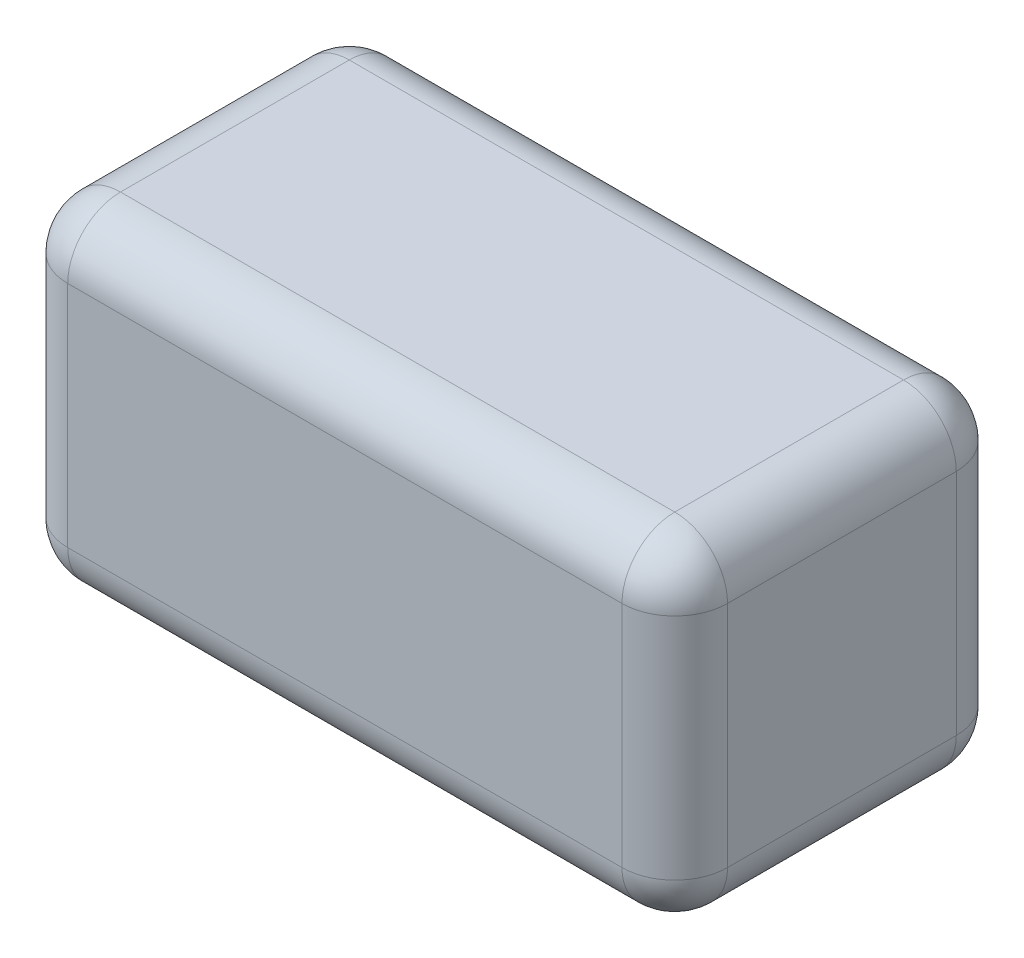
ISO-10303-21;
HEADER;
FILE_DESCRIPTION(('STEP AP214'),'2;1');
FILE_NAME('part.step','',(''),(''),'','','');
FILE_SCHEMA(('AUTOMOTIVE_DESIGN { 1 0 10303 214 1 1 1 1 }'));
ENDSEC;
DATA;
#1=APPLICATION_CONTEXT('core data for automotive mechanical design processes');
#2=APPLICATION_PROTOCOL_DEFINITION('international standard','automotive_design',2000,#1);
#3=PRODUCT_CONTEXT('',#1,'mechanical');
#4=PRODUCT('Part','Part','',(#3));
#5=PRODUCT_RELATED_PRODUCT_CATEGORY('part','',(#4));
#6=PRODUCT_DEFINITION_FORMATION('','',#4);
#7=PRODUCT_DEFINITION_CONTEXT('part definition',#1,'design');
#8=PRODUCT_DEFINITION('design','',#6,#7);
#9=PRODUCT_DEFINITION_SHAPE('','',#8);
#10=(LENGTH_UNIT() NAMED_UNIT(*) SI_UNIT(.MILLI.,.METRE.));
#11=(NAMED_UNIT(*) PLANE_ANGLE_UNIT() SI_UNIT($,.RADIAN.));
#12=(NAMED_UNIT(*) SI_UNIT($,.STERADIAN.) SOLID_ANGLE_UNIT());
#13=UNCERTAINTY_MEASURE_WITH_UNIT(LENGTH_MEASURE(1.E-05),#10,'distance_accuracy_value','');
#14=(GEOMETRIC_REPRESENTATION_CONTEXT(3) GLOBAL_UNCERTAINTY_ASSIGNED_CONTEXT((#13)) GLOBAL_UNIT_ASSIGNED_CONTEXT((#10,
#11,#12)) REPRESENTATION_CONTEXT('',''));
#15=CARTESIAN_POINT('',(0.,0.,0.));
#16=DIRECTION('',(0.,0.,1.));
#17=DIRECTION('',(1.,0.,0.));
#18=AXIS2_PLACEMENT_3D('',#15,#16,#17);
#19=CARTESIAN_POINT('',(31.5,13.,-31.));
#20=DIRECTION('',(0.,-1.,0.));
#21=DIRECTION('',(1.,0.,0.));
#22=AXIS2_PLACEMENT_3D('',#19,#20,#21);
#23=SPHERICAL_SURFACE('',#22,6.);
#24=CARTESIAN_POINT('',(31.5,13.,-31.));
#25=DIRECTION('',(0.,0.,-1.));
#26=DIRECTION('',(1.,0.,0.));
#27=AXIS2_PLACEMENT_3D('',#24,#25,#26);
#28=CIRCLE('',#27,6.);
#29=CARTESIAN_POINT('',(31.5,19.,-31.));
#30=VERTEX_POINT('',#29);
#31=CARTESIAN_POINT('',(37.5,13.,-31.));
#32=VERTEX_POINT('',#31);
#33=EDGE_CURVE('E10',#30,#32,#28,.T.);
#34=ORIENTED_EDGE('',*,*,#33,.F.);
#35=CARTESIAN_POINT('',(31.5,13.,-31.));
#36=DIRECTION('',(1.,0.,0.));
#37=DIRECTION('',(0.,0.,1.));
#38=AXIS2_PLACEMENT_3D('',#35,#36,#37);
#39=CIRCLE('',#38,6.);
#40=CARTESIAN_POINT('',(31.5,13.,-25.));
#41=VERTEX_POINT('',#40);
#42=EDGE_CURVE('E311',#30,#41,#39,.T.);
#43=ORIENTED_EDGE('',*,*,#42,.T.);
#44=CARTESIAN_POINT('',(31.5,13.,-31.));
#45=DIRECTION('',(0.,-1.,0.));
#46=DIRECTION('',(1.,0.,0.));
#47=AXIS2_PLACEMENT_3D('',#44,#45,#46);
#48=CIRCLE('',#47,6.);
#49=EDGE_CURVE('E319',#32,#41,#48,.T.);
#50=ORIENTED_EDGE('',*,*,#49,.F.);
#51=EDGE_LOOP('',(#34,#43,#50));
#52=FACE_BOUND('',#51,.T.);
#53=ADVANCED_FACE('F16',(#52),#23,.T.);
#54=CARTESIAN_POINT('',(31.5,13.,-57.));
#55=DIRECTION('',(0.,0.,1.));
#56=DIRECTION('',(1.,0.,0.));
#57=AXIS2_PLACEMENT_3D('',#54,#55,#56);
#58=SPHERICAL_SURFACE('',#57,6.);
#59=CARTESIAN_POINT('',(31.5,13.,-57.));
#60=DIRECTION('',(0.,-1.,0.));
#61=DIRECTION('',(1.,0.,0.));
#62=AXIS2_PLACEMENT_3D('',#59,#60,#61);
#63=CIRCLE('',#62,6.);
#64=CARTESIAN_POINT('',(31.5,13.,-63.));
#65=VERTEX_POINT('',#64);
#66=CARTESIAN_POINT('',(37.5,13.,-57.));
#67=VERTEX_POINT('',#66);
#68=EDGE_CURVE('E222',#65,#67,#63,.T.);
#69=ORIENTED_EDGE('',*,*,#68,.F.);
#70=CARTESIAN_POINT('',(31.5,13.,-57.));
#71=DIRECTION('',(1.,0.,0.));
#72=DIRECTION('',(0.,1.,0.));
#73=AXIS2_PLACEMENT_3D('',#70,#71,#72);
#74=CIRCLE('',#73,6.);
#75=CARTESIAN_POINT('',(31.5,19.,-57.));
#76=VERTEX_POINT('',#75);
#77=EDGE_CURVE('E223',#65,#76,#74,.T.);
#78=ORIENTED_EDGE('',*,*,#77,.T.);
#79=CARTESIAN_POINT('',(31.5,13.,-57.));
#80=DIRECTION('',(0.,0.,1.));
#81=DIRECTION('',(1.,0.,0.));
#82=AXIS2_PLACEMENT_3D('',#79,#80,#81);
#83=CIRCLE('',#82,6.);
#84=EDGE_CURVE('E26',#67,#76,#83,.T.);
#85=ORIENTED_EDGE('',*,*,#84,.F.);
#86=EDGE_LOOP('',(#69,#78,#85));
#87=FACE_BOUND('',#86,.T.);
#88=ADVANCED_FACE('F18',(#87),#58,.T.);
#89=CARTESIAN_POINT('',(37.5,-19.,-63.));
#90=DIRECTION('',(1.,0.,0.));
#91=DIRECTION('',(0.,1.,0.));
#92=AXIS2_PLACEMENT_3D('',#89,#90,#91);
#93=PLANE('',#92);
#94=DIRECTION('',(0.,0.,1.));
#95=VECTOR('',#94,1.);
#96=CARTESIAN_POINT('',(37.5,-13.,-63.));
#97=LINE('',#96,#95);
#98=CARTESIAN_POINT('',(37.5,-13.,-57.));
#99=VERTEX_POINT('',#98);
#100=CARTESIAN_POINT('',(37.5,-13.,-31.));
#101=VERTEX_POINT('',#100);
#102=EDGE_CURVE('E298',#99,#101,#97,.T.);
#103=ORIENTED_EDGE('',*,*,#102,.F.);
#104=DIRECTION('',(0.,1.,0.));
#105=VECTOR('',#104,1.);
#106=CARTESIAN_POINT('',(37.5,-19.,-57.));
#107=LINE('',#106,#105);
#108=EDGE_CURVE('E307',#99,#67,#107,.T.);
#109=ORIENTED_EDGE('',*,*,#108,.T.);
#110=DIRECTION('',(0.,0.,1.));
#111=VECTOR('',#110,1.);
#112=CARTESIAN_POINT('',(37.5,13.,-63.));
#113=LINE('',#112,#111);
#114=EDGE_CURVE('E20',#67,#32,#113,.T.);
#115=ORIENTED_EDGE('',*,*,#114,.T.);
#116=DIRECTION('',(0.,1.,0.));
#117=VECTOR('',#116,1.);
#118=CARTESIAN_POINT('',(37.5,-19.,-31.));
#119=LINE('',#118,#117);
#120=EDGE_CURVE('E315',#101,#32,#119,.T.);
#121=ORIENTED_EDGE('',*,*,#120,.F.);
#122=EDGE_LOOP('',(#103,#109,#115,#121));
#123=FACE_BOUND('',#122,.T.);
#124=ADVANCED_FACE('F334',(#123),#93,.T.);
#125=CARTESIAN_POINT('',(31.5,-13.,-31.));
#126=DIRECTION('',(0.,0.,-1.));
#127=DIRECTION('',(1.,0.,0.));
#128=AXIS2_PLACEMENT_3D('',#125,#126,#127);
#129=SPHERICAL_SURFACE('',#128,6.);
#130=CARTESIAN_POINT('',(31.5,-13.,-31.));
#131=DIRECTION('',(0.,1.,0.));
#132=DIRECTION('',(1.,0.,0.));
#133=AXIS2_PLACEMENT_3D('',#130,#131,#132);
#134=CIRCLE('',#133,6.);
#135=CARTESIAN_POINT('',(31.5,-13.,-25.));
#136=VERTEX_POINT('',#135);
#137=EDGE_CURVE('E321',#136,#101,#134,.T.);
#138=ORIENTED_EDGE('',*,*,#137,.F.);
#139=CARTESIAN_POINT('',(31.5,-13.,-31.));
#140=DIRECTION('',(1.,0.,0.));
#141=DIRECTION('',(0.,-1.,0.));
#142=AXIS2_PLACEMENT_3D('',#139,#140,#141);
#143=CIRCLE('',#142,6.);
#144=CARTESIAN_POINT('',(31.5,-19.,-31.));
#145=VERTEX_POINT('',#144);
#146=EDGE_CURVE('E245',#136,#145,#143,.T.);
#147=ORIENTED_EDGE('',*,*,#146,.T.);
#148=CARTESIAN_POINT('',(31.5,-13.,-31.));
#149=DIRECTION('',(0.,0.,-1.));
#150=DIRECTION('',(1.,0.,0.));
#151=AXIS2_PLACEMENT_3D('',#148,#149,#150);
#152=CIRCLE('',#151,6.);
#153=EDGE_CURVE('E241',#101,#145,#152,.T.);
#154=ORIENTED_EDGE('',*,*,#153,.F.);
#155=EDGE_LOOP('',(#138,#147,#154));
#156=FACE_BOUND('',#155,.T.);
#157=ADVANCED_FACE('F359',(#156),#129,.T.);
#158=CARTESIAN_POINT('',(31.5,-13.,-57.));
#159=DIRECTION('',(0.,0.,1.));
#160=DIRECTION('',(1.,0.,0.));
#161=AXIS2_PLACEMENT_3D('',#158,#159,#160);
#162=SPHERICAL_SURFACE('',#161,6.);
#163=CARTESIAN_POINT('',(31.5,-13.,-57.));
#164=DIRECTION('',(0.,0.,-1.));
#165=DIRECTION('',(1.,0.,0.));
#166=AXIS2_PLACEMENT_3D('',#163,#164,#165);
#167=CIRCLE('',#166,6.);
#168=CARTESIAN_POINT('',(31.5,-19.,-57.));
#169=VERTEX_POINT('',#168);
#170=EDGE_CURVE('E244',#99,#169,#167,.T.);
#171=ORIENTED_EDGE('',*,*,#170,.T.);
#172=CARTESIAN_POINT('',(31.5,-13.,-57.));
#173=DIRECTION('',(-1.,0.,0.));
#174=DIRECTION('',(0.,-1.,0.));
#175=AXIS2_PLACEMENT_3D('',#172,#173,#174);
#176=CIRCLE('',#175,6.);
#177=CARTESIAN_POINT('',(31.5,-13.,-63.));
#178=VERTEX_POINT('',#177);
#179=EDGE_CURVE('E289',#178,#169,#176,.T.);
#180=ORIENTED_EDGE('',*,*,#179,.F.);
#181=CARTESIAN_POINT('',(31.5,-13.,-57.));
#182=DIRECTION('',(0.,-1.,0.));
#183=DIRECTION('',(1.,0.,0.));
#184=AXIS2_PLACEMENT_3D('',#181,#182,#183);
#185=CIRCLE('',#184,6.);
#186=EDGE_CURVE('E218',#178,#99,#185,.T.);
#187=ORIENTED_EDGE('',*,*,#186,.T.);
#188=EDGE_LOOP('',(#171,#180,#187));
#189=FACE_BOUND('',#188,.T.);
#190=ADVANCED_FACE('F350',(#189),#162,.T.);
#191=CARTESIAN_POINT('',(31.5,13.,-63.));
#192=DIRECTION('',(0.,0.,1.));
#193=DIRECTION('',(1.,0.,0.));
#194=AXIS2_PLACEMENT_3D('',#191,#192,#193);
#195=CYLINDRICAL_SURFACE('',#194,6.);
#196=ORIENTED_EDGE('',*,*,#114,.F.);
#197=ORIENTED_EDGE('',*,*,#84,.T.);
#198=DIRECTION('',(0.,0.,1.));
#199=VECTOR('',#198,1.);
#200=CARTESIAN_POINT('',(31.5,19.,-63.));
#201=LINE('',#200,#199);
#202=EDGE_CURVE('E282',#76,#30,#201,.T.);
#203=ORIENTED_EDGE('',*,*,#202,.T.);
#204=ORIENTED_EDGE('',*,*,#33,.T.);
#205=EDGE_LOOP('',(#196,#197,#203,#204));
#206=FACE_BOUND('',#205,.T.);
#207=ADVANCED_FACE('F340',(#206),#195,.T.);
#208=CARTESIAN_POINT('',(31.5,-19.,-31.));
#209=DIRECTION('',(0.,1.,0.));
#210=DIRECTION('',(1.,0.,0.));
#211=AXIS2_PLACEMENT_3D('',#208,#209,#210);
#212=CYLINDRICAL_SURFACE('',#211,6.);
#213=ORIENTED_EDGE('',*,*,#120,.T.);
#214=ORIENTED_EDGE('',*,*,#49,.T.);
#215=DIRECTION('',(0.,1.,0.));
#216=VECTOR('',#215,1.);
#217=CARTESIAN_POINT('',(31.5,-19.,-25.));
#218=LINE('',#217,#216);
#219=EDGE_CURVE('E267',#136,#41,#218,.T.);
#220=ORIENTED_EDGE('',*,*,#219,.F.);
#221=ORIENTED_EDGE('',*,*,#137,.T.);
#222=EDGE_LOOP('',(#213,#214,#220,#221));
#223=FACE_BOUND('',#222,.T.);
#224=ADVANCED_FACE('F337',(#223),#212,.T.);
#225=CARTESIAN_POINT('',(-37.5,13.,-31.));
#226=DIRECTION('',(1.,0.,0.));
#227=DIRECTION('',(0.,1.,0.));
#228=AXIS2_PLACEMENT_3D('',#225,#226,#227);
#229=CYLINDRICAL_SURFACE('',#228,6.);
#230=CARTESIAN_POINT('',(-31.5,13.,-31.));
#231=DIRECTION('',(1.,0.,0.));
#232=DIRECTION('',(0.,0.,1.));
#233=AXIS2_PLACEMENT_3D('',#230,#231,#232);
#234=CIRCLE('',#233,6.);
#235=CARTESIAN_POINT('',(-31.5,19.,-31.));
#236=VERTEX_POINT('',#235);
#237=CARTESIAN_POINT('',(-31.5,13.,-25.));
#238=VERTEX_POINT('',#237);
#239=EDGE_CURVE('E275',#236,#238,#234,.T.);
#240=ORIENTED_EDGE('',*,*,#239,.T.);
#241=DIRECTION('',(1.,0.,0.));
#242=VECTOR('',#241,1.);
#243=CARTESIAN_POINT('',(-37.5,13.,-25.));
#244=LINE('',#243,#242);
#245=EDGE_CURVE('E271',#238,#41,#244,.T.);
#246=ORIENTED_EDGE('',*,*,#245,.T.);
#247=ORIENTED_EDGE('',*,*,#42,.F.);
#248=DIRECTION('',(1.,0.,0.));
#249=VECTOR('',#248,1.);
#250=CARTESIAN_POINT('',(-37.5,19.,-31.));
#251=LINE('',#250,#249);
#252=EDGE_CURVE('E278',#236,#30,#251,.T.);
#253=ORIENTED_EDGE('',*,*,#252,.F.);
#254=EDGE_LOOP('',(#240,#246,#247,#253));
#255=FACE_BOUND('',#254,.T.);
#256=ADVANCED_FACE('F339',(#255),#229,.T.);
#257=CARTESIAN_POINT('',(31.5,-19.,-57.));
#258=DIRECTION('',(0.,1.,0.));
#259=DIRECTION('',(1.,0.,0.));
#260=AXIS2_PLACEMENT_3D('',#257,#258,#259);
#261=CYLINDRICAL_SURFACE('',#260,6.);
#262=ORIENTED_EDGE('',*,*,#186,.F.);
#263=DIRECTION('',(0.,1.,0.));
#264=VECTOR('',#263,1.);
#265=CARTESIAN_POINT('',(31.5,-19.,-63.));
#266=LINE('',#265,#264);
#267=EDGE_CURVE('E257',#178,#65,#266,.T.);
#268=ORIENTED_EDGE('',*,*,#267,.T.);
#269=ORIENTED_EDGE('',*,*,#68,.T.);
#270=ORIENTED_EDGE('',*,*,#108,.F.);
#271=EDGE_LOOP('',(#262,#268,#269,#270));
#272=FACE_BOUND('',#271,.T.);
#273=ADVANCED_FACE('F347',(#272),#261,.T.);
#274=CARTESIAN_POINT('',(-37.5,13.,-57.));
#275=DIRECTION('',(1.,0.,0.));
#276=DIRECTION('',(0.,1.,0.));
#277=AXIS2_PLACEMENT_3D('',#274,#275,#276);
#278=CYLINDRICAL_SURFACE('',#277,6.);
#279=DIRECTION('',(1.,0.,0.));
#280=VECTOR('',#279,1.);
#281=CARTESIAN_POINT('',(-37.5,19.,-57.));
#282=LINE('',#281,#280);
#283=CARTESIAN_POINT('',(-31.5,19.,-57.));
#284=VERTEX_POINT('',#283);
#285=EDGE_CURVE('E285',#284,#76,#282,.T.);
#286=ORIENTED_EDGE('',*,*,#285,.T.);
#287=ORIENTED_EDGE('',*,*,#77,.F.);
#288=DIRECTION('',(1.,0.,0.));
#289=VECTOR('',#288,1.);
#290=CARTESIAN_POINT('',(-37.5,13.,-63.));
#291=LINE('',#290,#289);
#292=CARTESIAN_POINT('',(-31.5,13.,-63.));
#293=VERTEX_POINT('',#292);
#294=EDGE_CURVE('E253',#293,#65,#291,.T.);
#295=ORIENTED_EDGE('',*,*,#294,.F.);
#296=CARTESIAN_POINT('',(-31.5,13.,-57.));
#297=DIRECTION('',(1.,0.,0.));
#298=DIRECTION('',(0.,1.,0.));
#299=AXIS2_PLACEMENT_3D('',#296,#297,#298);
#300=CIRCLE('',#299,6.);
#301=EDGE_CURVE('E226',#293,#284,#300,.T.);
#302=ORIENTED_EDGE('',*,*,#301,.T.);
#303=EDGE_LOOP('',(#286,#287,#295,#302));
#304=FACE_BOUND('',#303,.T.);
#305=ADVANCED_FACE('F412',(#304),#278,.T.);
#306=CARTESIAN_POINT('',(31.5,-13.,-63.));
#307=DIRECTION('',(0.,0.,1.));
#308=DIRECTION('',(1.,0.,0.));
#309=AXIS2_PLACEMENT_3D('',#306,#307,#308);
#310=CYLINDRICAL_SURFACE('',#309,6.);
#311=ORIENTED_EDGE('',*,*,#153,.T.);
#312=DIRECTION('',(0.,0.,1.));
#313=VECTOR('',#312,1.);
#314=CARTESIAN_POINT('',(31.5,-19.,-63.));
#315=LINE('',#314,#313);
#316=EDGE_CURVE('E240',#169,#145,#315,.T.);
#317=ORIENTED_EDGE('',*,*,#316,.F.);
#318=ORIENTED_EDGE('',*,*,#170,.F.);
#319=ORIENTED_EDGE('',*,*,#102,.T.);
#320=EDGE_LOOP('',(#311,#317,#318,#319));
#321=FACE_BOUND('',#320,.T.);
#322=ADVANCED_FACE('F423',(#321),#310,.T.);
#323=CARTESIAN_POINT('',(-37.5,-13.,-31.));
#324=DIRECTION('',(1.,0.,0.));
#325=DIRECTION('',(0.,-1.,0.));
#326=AXIS2_PLACEMENT_3D('',#323,#324,#325);
#327=CYLINDRICAL_SURFACE('',#326,6.);
#328=DIRECTION('',(1.,0.,0.));
#329=VECTOR('',#328,1.);
#330=CARTESIAN_POINT('',(-37.5,-19.,-31.));
#331=LINE('',#330,#329);
#332=CARTESIAN_POINT('',(-31.5,-19.,-31.));
#333=VERTEX_POINT('',#332);
#334=EDGE_CURVE('E249',#333,#145,#331,.T.);
#335=ORIENTED_EDGE('',*,*,#334,.T.);
#336=ORIENTED_EDGE('',*,*,#146,.F.);
#337=DIRECTION('',(1.,0.,0.));
#338=VECTOR('',#337,1.);
#339=CARTESIAN_POINT('',(-37.5,-13.,-25.));
#340=LINE('',#339,#338);
#341=CARTESIAN_POINT('',(-31.5,-13.,-25.));
#342=VERTEX_POINT('',#341);
#343=EDGE_CURVE('E230',#342,#136,#340,.T.);
#344=ORIENTED_EDGE('',*,*,#343,.F.);
#345=CARTESIAN_POINT('',(-31.5,-13.,-31.));
#346=DIRECTION('',(1.,0.,0.));
#347=DIRECTION('',(0.,-1.,0.));
#348=AXIS2_PLACEMENT_3D('',#345,#346,#347);
#349=CIRCLE('',#348,6.);
#350=EDGE_CURVE('E142',#342,#333,#349,.T.);
#351=ORIENTED_EDGE('',*,*,#350,.T.);
#352=EDGE_LOOP('',(#335,#336,#344,#351));
#353=FACE_BOUND('',#352,.T.);
#354=ADVANCED_FACE('F434',(#353),#327,.T.);
#355=CARTESIAN_POINT('',(-37.5,-13.,-57.));
#356=DIRECTION('',(1.,0.,0.));
#357=DIRECTION('',(0.,-1.,0.));
#358=AXIS2_PLACEMENT_3D('',#355,#356,#357);
#359=CYLINDRICAL_SURFACE('',#358,6.);
#360=CARTESIAN_POINT('',(-31.5,-13.,-57.));
#361=DIRECTION('',(-1.,0.,0.));
#362=DIRECTION('',(0.,-1.,0.));
#363=AXIS2_PLACEMENT_3D('',#360,#361,#362);
#364=CIRCLE('',#363,6.);
#365=CARTESIAN_POINT('',(-31.5,-13.,-63.));
#366=VERTEX_POINT('',#365);
#367=CARTESIAN_POINT('',(-31.5,-19.,-57.));
#368=VERTEX_POINT('',#367);
#369=EDGE_CURVE('E200',#366,#368,#364,.T.);
#370=ORIENTED_EDGE('',*,*,#369,.F.);
#371=DIRECTION('',(1.,0.,0.));
#372=VECTOR('',#371,1.);
#373=CARTESIAN_POINT('',(-37.5,-13.,-63.));
#374=LINE('',#373,#372);
#375=EDGE_CURVE('E231',#366,#178,#374,.T.);
#376=ORIENTED_EDGE('',*,*,#375,.T.);
#377=ORIENTED_EDGE('',*,*,#179,.T.);
#378=DIRECTION('',(1.,0.,0.));
#379=VECTOR('',#378,1.);
#380=CARTESIAN_POINT('',(-37.5,-19.,-57.));
#381=LINE('',#380,#379);
#382=EDGE_CURVE('E215',#368,#169,#381,.T.);
#383=ORIENTED_EDGE('',*,*,#382,.F.);
#384=EDGE_LOOP('',(#370,#376,#377,#383));
#385=FACE_BOUND('',#384,.T.);
#386=ADVANCED_FACE('F445',(#385),#359,.T.);
#387=CARTESIAN_POINT('',(-37.5,19.,-63.));
#388=DIRECTION('',(0.,1.,0.));
#389=DIRECTION('',(1.,0.,0.));
#390=AXIS2_PLACEMENT_3D('',#387,#388,#389);
#391=PLANE('',#390);
#392=DIRECTION('',(0.,0.,1.));
#393=VECTOR('',#392,1.);
#394=CARTESIAN_POINT('',(-31.5,19.,-63.));
#395=LINE('',#394,#393);
#396=EDGE_CURVE('E201',#284,#236,#395,.T.);
#397=ORIENTED_EDGE('',*,*,#396,.T.);
#398=ORIENTED_EDGE('',*,*,#252,.T.);
#399=ORIENTED_EDGE('',*,*,#202,.F.);
#400=ORIENTED_EDGE('',*,*,#285,.F.);
#401=EDGE_LOOP('',(#397,#398,#399,#400));
#402=FACE_BOUND('',#401,.T.);
#403=ADVANCED_FACE('F456',(#402),#391,.T.);
#404=CARTESIAN_POINT('',(-31.5,13.,-31.));
#405=DIRECTION('',(0.,-1.,0.));
#406=DIRECTION('',(-1.,0.,0.));
#407=AXIS2_PLACEMENT_3D('',#404,#405,#406);
#408=SPHERICAL_SURFACE('',#407,6.);
#409=CARTESIAN_POINT('',(-31.5,13.,-31.));
#410=DIRECTION('',(0.,1.,0.));
#411=DIRECTION('',(-1.,0.,0.));
#412=AXIS2_PLACEMENT_3D('',#409,#410,#411);
#413=CIRCLE('',#412,6.);
#414=CARTESIAN_POINT('',(-37.5,13.,-31.));
#415=VERTEX_POINT('',#414);
#416=EDGE_CURVE('E176',#415,#238,#413,.T.);
#417=ORIENTED_EDGE('',*,*,#416,.T.);
#418=ORIENTED_EDGE('',*,*,#239,.F.);
#419=CARTESIAN_POINT('',(-31.5,13.,-31.));
#420=DIRECTION('',(0.,0.,1.));
#421=DIRECTION('',(-1.,0.,0.));
#422=AXIS2_PLACEMENT_3D('',#419,#420,#421);
#423=CIRCLE('',#422,6.);
#424=EDGE_CURVE('E187',#236,#415,#423,.T.);
#425=ORIENTED_EDGE('',*,*,#424,.T.);
#426=EDGE_LOOP('',(#417,#418,#425));
#427=FACE_BOUND('',#426,.T.);
#428=ADVANCED_FACE('F467',(#427),#408,.T.);
#429=CARTESIAN_POINT('',(-37.5,-19.,-25.));
#430=DIRECTION('',(0.,0.,1.));
#431=DIRECTION('',(1.,0.,0.));
#432=AXIS2_PLACEMENT_3D('',#429,#430,#431);
#433=PLANE('',#432);
#434=DIRECTION('',(0.,1.,0.));
#435=VECTOR('',#434,1.);
#436=CARTESIAN_POINT('',(-31.5,-19.,-25.));
#437=LINE('',#436,#435);
#438=EDGE_CURVE('E148',#342,#238,#437,.T.);
#439=ORIENTED_EDGE('',*,*,#438,.F.);
#440=ORIENTED_EDGE('',*,*,#343,.T.);
#441=ORIENTED_EDGE('',*,*,#219,.T.);
#442=ORIENTED_EDGE('',*,*,#245,.F.);
#443=EDGE_LOOP('',(#439,#440,#441,#442));
#444=FACE_BOUND('',#443,.T.);
#445=ADVANCED_FACE('F478',(#444),#433,.T.);
#446=CARTESIAN_POINT('',(-31.5,13.,-57.));
#447=DIRECTION('',(0.,0.,1.));
#448=DIRECTION('',(-1.,0.,0.));
#449=AXIS2_PLACEMENT_3D('',#446,#447,#448);
#450=SPHERICAL_SURFACE('',#449,6.);
#451=CARTESIAN_POINT('',(-31.5,13.,-57.));
#452=DIRECTION('',(0.,0.,-1.));
#453=DIRECTION('',(-1.,0.,0.));
#454=AXIS2_PLACEMENT_3D('',#451,#452,#453);
#455=CIRCLE('',#454,6.);
#456=CARTESIAN_POINT('',(-37.5,13.,-57.));
#457=VERTEX_POINT('',#456);
#458=EDGE_CURVE('E196',#457,#284,#455,.T.);
#459=ORIENTED_EDGE('',*,*,#458,.T.);
#460=ORIENTED_EDGE('',*,*,#301,.F.);
#461=CARTESIAN_POINT('',(-31.5,13.,-57.));
#462=DIRECTION('',(0.,1.,0.));
#463=DIRECTION('',(-1.,0.,0.));
#464=AXIS2_PLACEMENT_3D('',#461,#462,#463);
#465=CIRCLE('',#464,6.);
#466=EDGE_CURVE('E161',#293,#457,#465,.T.);
#467=ORIENTED_EDGE('',*,*,#466,.T.);
#468=EDGE_LOOP('',(#459,#460,#467));
#469=FACE_BOUND('',#468,.T.);
#470=ADVANCED_FACE('F489',(#469),#450,.T.);
#471=CARTESIAN_POINT('',(-37.5,-19.,-63.));
#472=DIRECTION('',(0.,0.,1.));
#473=DIRECTION('',(1.,0.,0.));
#474=AXIS2_PLACEMENT_3D('',#471,#472,#473);
#475=PLANE('',#474);
#476=ORIENTED_EDGE('',*,*,#294,.T.);
#477=ORIENTED_EDGE('',*,*,#267,.F.);
#478=ORIENTED_EDGE('',*,*,#375,.F.);
#479=DIRECTION('',(0.,1.,0.));
#480=VECTOR('',#479,1.);
#481=CARTESIAN_POINT('',(-31.5,-19.,-63.));
#482=LINE('',#481,#480);
#483=EDGE_CURVE('E189',#366,#293,#482,.T.);
#484=ORIENTED_EDGE('',*,*,#483,.T.);
#485=EDGE_LOOP('',(#476,#477,#478,#484));
#486=FACE_BOUND('',#485,.T.);
#487=ADVANCED_FACE('F500',(#486),#475,.F.);
#488=CARTESIAN_POINT('',(-37.5,-19.,-63.));
#489=DIRECTION('',(0.,1.,0.));
#490=DIRECTION('',(1.,0.,0.));
#491=AXIS2_PLACEMENT_3D('',#488,#489,#490);
#492=PLANE('',#491);
#493=ORIENTED_EDGE('',*,*,#382,.T.);
#494=ORIENTED_EDGE('',*,*,#316,.T.);
#495=ORIENTED_EDGE('',*,*,#334,.F.);
#496=DIRECTION('',(0.,0.,1.));
#497=VECTOR('',#496,1.);
#498=CARTESIAN_POINT('',(-31.5,-19.,-63.));
#499=LINE('',#498,#497);
#500=EDGE_CURVE('E159',#368,#333,#499,.T.);
#501=ORIENTED_EDGE('',*,*,#500,.F.);
#502=EDGE_LOOP('',(#493,#494,#495,#501));
#503=FACE_BOUND('',#502,.T.);
#504=ADVANCED_FACE('F511',(#503),#492,.F.);
#505=CARTESIAN_POINT('',(-31.5,-13.,-31.));
#506=DIRECTION('',(0.,0.,-1.));
#507=DIRECTION('',(-1.,0.,0.));
#508=AXIS2_PLACEMENT_3D('',#505,#506,#507);
#509=SPHERICAL_SURFACE('',#508,6.);
#510=CARTESIAN_POINT('',(-31.5,-13.,-31.));
#511=DIRECTION('',(0.,0.,1.));
#512=DIRECTION('',(-1.,0.,0.));
#513=AXIS2_PLACEMENT_3D('',#510,#511,#512);
#514=CIRCLE('',#513,6.);
#515=CARTESIAN_POINT('',(-37.5,-13.,-31.));
#516=VERTEX_POINT('',#515);
#517=EDGE_CURVE('E139',#516,#333,#514,.T.);
#518=ORIENTED_EDGE('',*,*,#517,.T.);
#519=ORIENTED_EDGE('',*,*,#350,.F.);
#520=CARTESIAN_POINT('',(-31.5,-13.,-31.));
#521=DIRECTION('',(0.,-1.,0.));
#522=DIRECTION('',(-1.,0.,0.));
#523=AXIS2_PLACEMENT_3D('',#520,#521,#522);
#524=CIRCLE('',#523,6.);
#525=EDGE_CURVE('E136',#342,#516,#524,.T.);
#526=ORIENTED_EDGE('',*,*,#525,.T.);
#527=EDGE_LOOP('',(#518,#519,#526));
#528=FACE_BOUND('',#527,.T.);
#529=ADVANCED_FACE('F138',(#528),#509,.T.);
#530=CARTESIAN_POINT('',(-31.5,-13.,-57.));
#531=DIRECTION('',(0.,0.,1.));
#532=DIRECTION('',(-1.,0.,0.));
#533=AXIS2_PLACEMENT_3D('',#530,#531,#532);
#534=SPHERICAL_SURFACE('',#533,6.);
#535=CARTESIAN_POINT('',(-31.5,-13.,-57.));
#536=DIRECTION('',(0.,1.,0.));
#537=DIRECTION('',(-1.,0.,0.));
#538=AXIS2_PLACEMENT_3D('',#535,#536,#537);
#539=CIRCLE('',#538,6.);
#540=CARTESIAN_POINT('',(-37.5,-13.,-57.));
#541=VERTEX_POINT('',#540);
#542=EDGE_CURVE('E149',#366,#541,#539,.T.);
#543=ORIENTED_EDGE('',*,*,#542,.F.);
#544=ORIENTED_EDGE('',*,*,#369,.T.);
#545=CARTESIAN_POINT('',(-31.5,-13.,-57.));
#546=DIRECTION('',(0.,0.,1.));
#547=DIRECTION('',(-1.,0.,0.));
#548=AXIS2_PLACEMENT_3D('',#545,#546,#547);
#549=CIRCLE('',#548,6.);
#550=EDGE_CURVE('E171',#541,#368,#549,.T.);
#551=ORIENTED_EDGE('',*,*,#550,.F.);
#552=EDGE_LOOP('',(#543,#544,#551));
#553=FACE_BOUND('',#552,.T.);
#554=ADVANCED_FACE('F532',(#553),#534,.T.);
#555=CARTESIAN_POINT('',(-31.5,13.,-63.));
#556=DIRECTION('',(0.,0.,1.));
#557=DIRECTION('',(-1.,0.,0.));
#558=AXIS2_PLACEMENT_3D('',#555,#556,#557);
#559=CYLINDRICAL_SURFACE('',#558,6.);
#560=ORIENTED_EDGE('',*,*,#424,.F.);
#561=ORIENTED_EDGE('',*,*,#396,.F.);
#562=ORIENTED_EDGE('',*,*,#458,.F.);
#563=DIRECTION('',(0.,0.,1.));
#564=VECTOR('',#563,1.);
#565=CARTESIAN_POINT('',(-37.5,13.,-63.));
#566=LINE('',#565,#564);
#567=EDGE_CURVE('E179',#457,#415,#566,.T.);
#568=ORIENTED_EDGE('',*,*,#567,.T.);
#569=EDGE_LOOP('',(#560,#561,#562,#568));
#570=FACE_BOUND('',#569,.T.);
#571=ADVANCED_FACE('F542',(#570),#559,.T.);
#572=CARTESIAN_POINT('',(-31.5,-19.,-31.));
#573=DIRECTION('',(0.,1.,0.));
#574=DIRECTION('',(-1.,0.,0.));
#575=AXIS2_PLACEMENT_3D('',#572,#573,#574);
#576=CYLINDRICAL_SURFACE('',#575,6.);
#577=ORIENTED_EDGE('',*,*,#525,.F.);
#578=ORIENTED_EDGE('',*,*,#438,.T.);
#579=ORIENTED_EDGE('',*,*,#416,.F.);
#580=DIRECTION('',(0.,1.,0.));
#581=VECTOR('',#580,1.);
#582=CARTESIAN_POINT('',(-37.5,-19.,-31.));
#583=LINE('',#582,#581);
#584=EDGE_CURVE('E167',#516,#415,#583,.T.);
#585=ORIENTED_EDGE('',*,*,#584,.F.);
#586=EDGE_LOOP('',(#577,#578,#579,#585));
#587=FACE_BOUND('',#586,.T.);
#588=ADVANCED_FACE('F174',(#587),#576,.T.);
#589=CARTESIAN_POINT('',(-31.5,-19.,-57.));
#590=DIRECTION('',(0.,1.,0.));
#591=DIRECTION('',(-1.,0.,0.));
#592=AXIS2_PLACEMENT_3D('',#589,#590,#591);
#593=CYLINDRICAL_SURFACE('',#592,6.);
#594=DIRECTION('',(0.,1.,0.));
#595=VECTOR('',#594,1.);
#596=CARTESIAN_POINT('',(-37.5,-19.,-57.));
#597=LINE('',#596,#595);
#598=EDGE_CURVE('E169',#541,#457,#597,.T.);
#599=ORIENTED_EDGE('',*,*,#598,.T.);
#600=ORIENTED_EDGE('',*,*,#466,.F.);
#601=ORIENTED_EDGE('',*,*,#483,.F.);
#602=ORIENTED_EDGE('',*,*,#542,.T.);
#603=EDGE_LOOP('',(#599,#600,#601,#602));
#604=FACE_BOUND('',#603,.T.);
#605=ADVANCED_FACE('F563',(#604),#593,.T.);
#606=CARTESIAN_POINT('',(-31.5,-13.,-63.));
#607=DIRECTION('',(0.,0.,1.));
#608=DIRECTION('',(-1.,0.,0.));
#609=AXIS2_PLACEMENT_3D('',#606,#607,#608);
#610=CYLINDRICAL_SURFACE('',#609,6.);
#611=DIRECTION('',(0.,0.,1.));
#612=VECTOR('',#611,1.);
#613=CARTESIAN_POINT('',(-37.5,-13.,-63.));
#614=LINE('',#613,#612);
#615=EDGE_CURVE('E156',#541,#516,#614,.T.);
#616=ORIENTED_EDGE('',*,*,#615,.F.);
#617=ORIENTED_EDGE('',*,*,#550,.T.);
#618=ORIENTED_EDGE('',*,*,#500,.T.);
#619=ORIENTED_EDGE('',*,*,#517,.F.);
#620=EDGE_LOOP('',(#616,#617,#618,#619));
#621=FACE_BOUND('',#620,.T.);
#622=ADVANCED_FACE('F154',(#621),#610,.T.);
#623=CARTESIAN_POINT('',(-37.5,-19.,-63.));
#624=DIRECTION('',(1.,0.,0.));
#625=DIRECTION('',(0.,1.,0.));
#626=AXIS2_PLACEMENT_3D('',#623,#624,#625);
#627=PLANE('',#626);
#628=ORIENTED_EDGE('',*,*,#584,.T.);
#629=ORIENTED_EDGE('',*,*,#567,.F.);
#630=ORIENTED_EDGE('',*,*,#598,.F.);
#631=ORIENTED_EDGE('',*,*,#615,.T.);
#632=EDGE_LOOP('',(#628,#629,#630,#631));
#633=FACE_BOUND('',#632,.T.);
#634=ADVANCED_FACE('F165',(#633),#627,.F.);
#635=CLOSED_SHELL('',(#53,#88,#124,#157,#190,#207,#224,#256,#273,#305,#322,#354,#386,#403,#428,
#445,#470,#487,#504,#529,#554,#571,#588,#605,#622,#634));
#636=MANIFOLD_SOLID_BREP('B1',#635);
#637=ADVANCED_BREP_SHAPE_REPRESENTATION('',(#18,#636),#14);
#638=SHAPE_DEFINITION_REPRESENTATION(#9,#637);
ENDSEC;
END-ISO-10303-21;
